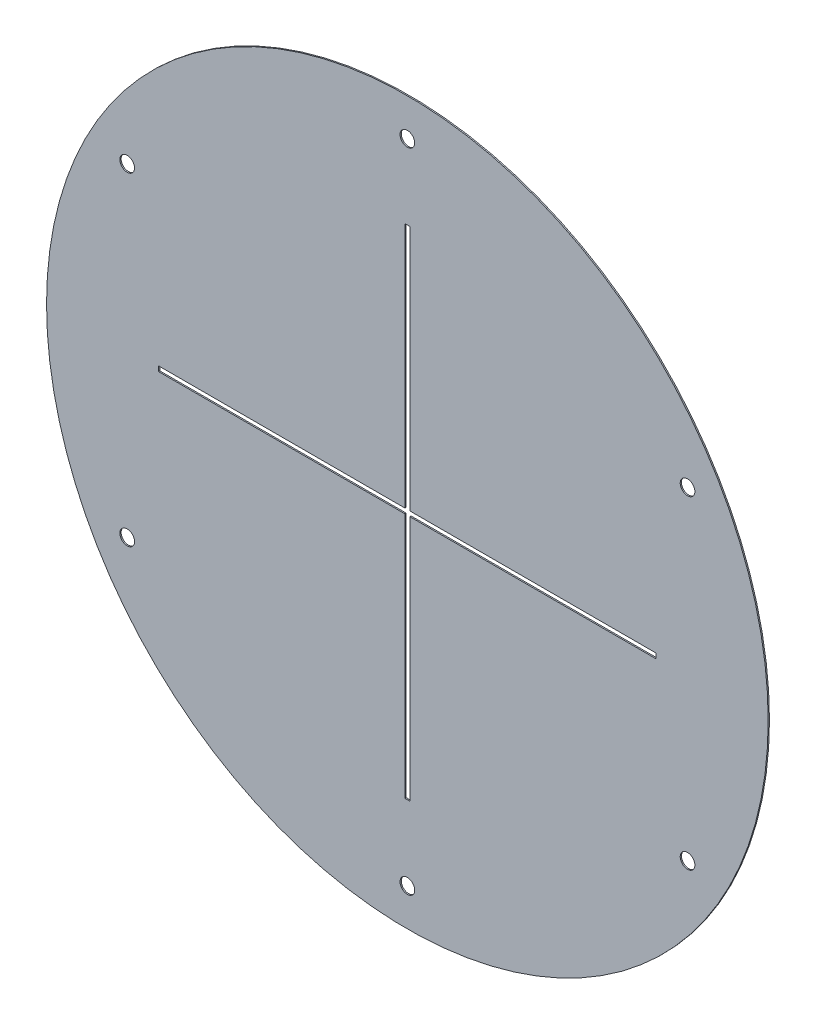
ISO-10303-21;
HEADER;
FILE_DESCRIPTION(('STEP AP214'),'2;1');
FILE_NAME('part.step','',(''),(''),'','','');
FILE_SCHEMA(('AUTOMOTIVE_DESIGN { 1 0 10303 214 1 1 1 1 }'));
ENDSEC;
DATA;
#1=APPLICATION_CONTEXT('core data for automotive mechanical design processes');
#2=APPLICATION_PROTOCOL_DEFINITION('international standard','automotive_design',2000,#1);
#3=PRODUCT_CONTEXT('',#1,'mechanical');
#4=PRODUCT('Part','Part','',(#3));
#5=PRODUCT_RELATED_PRODUCT_CATEGORY('part','',(#4));
#6=PRODUCT_DEFINITION_FORMATION('','',#4);
#7=PRODUCT_DEFINITION_CONTEXT('part definition',#1,'design');
#8=PRODUCT_DEFINITION('design','',#6,#7);
#9=PRODUCT_DEFINITION_SHAPE('','',#8);
#10=(LENGTH_UNIT() NAMED_UNIT(*) SI_UNIT(.MILLI.,.METRE.));
#11=(NAMED_UNIT(*) PLANE_ANGLE_UNIT() SI_UNIT($,.RADIAN.));
#12=(NAMED_UNIT(*) SI_UNIT($,.STERADIAN.) SOLID_ANGLE_UNIT());
#13=UNCERTAINTY_MEASURE_WITH_UNIT(LENGTH_MEASURE(1.E-05),#10,'distance_accuracy_value','');
#14=(GEOMETRIC_REPRESENTATION_CONTEXT(3) GLOBAL_UNCERTAINTY_ASSIGNED_CONTEXT((#13)) GLOBAL_UNIT_ASSIGNED_CONTEXT((#10,
#11,#12)) REPRESENTATION_CONTEXT('',''));
#15=CARTESIAN_POINT('',(0.,0.,0.));
#16=DIRECTION('',(0.,0.,1.));
#17=DIRECTION('',(1.,0.,0.));
#18=AXIS2_PLACEMENT_3D('',#15,#16,#17);
#19=CARTESIAN_POINT('',(0.,0.,0.254));
#20=DIRECTION('',(0.,0.,1.));
#21=DIRECTION('',(1.,0.,0.));
#22=AXIS2_PLACEMENT_3D('',#19,#20,#21);
#23=PLANE('',#22);
#24=CARTESIAN_POINT('',(0.,65.,0.254));
#25=DIRECTION('',(0.,0.,1.));
#26=DIRECTION('',(1.,0.,0.));
#27=AXIS2_PLACEMENT_3D('',#24,#25,#26);
#28=CIRCLE('',#27,1.4732);
#29=CARTESIAN_POINT('',(1.4732,65.,0.254));
#30=VERTEX_POINT('',#29);
#31=EDGE_CURVE('E510',#30,#30,#28,.T.);
#32=ORIENTED_EDGE('',*,*,#31,.F.);
#33=EDGE_LOOP('',(#32));
#34=FACE_BOUND('',#33,.T.);
#35=CARTESIAN_POINT('',(-56.2916512459885,-32.5,0.254));
#36=DIRECTION('',(0.,0.,1.));
#37=DIRECTION('',(1.,0.,0.));
#38=AXIS2_PLACEMENT_3D('',#35,#36,#37);
#39=CIRCLE('',#38,1.47319999999998);
#40=CARTESIAN_POINT('',(-54.8184512459885,-32.5,0.254));
#41=VERTEX_POINT('',#40);
#42=EDGE_CURVE('E522',#41,#41,#39,.T.);
#43=ORIENTED_EDGE('',*,*,#42,.F.);
#44=EDGE_LOOP('',(#43));
#45=FACE_BOUND('',#44,.T.);
#46=CARTESIAN_POINT('',(56.2916512459885,-32.5,0.254));
#47=DIRECTION('',(0.,0.,1.));
#48=DIRECTION('',(1.,0.,0.));
#49=AXIS2_PLACEMENT_3D('',#46,#47,#48);
#50=CIRCLE('',#49,1.4732);
#51=CARTESIAN_POINT('',(57.7648512459885,-32.5,0.254));
#52=VERTEX_POINT('',#51);
#53=EDGE_CURVE('E173',#52,#52,#50,.T.);
#54=ORIENTED_EDGE('',*,*,#53,.F.);
#55=EDGE_LOOP('',(#54));
#56=FACE_BOUND('',#55,.T.);
#57=CARTESIAN_POINT('',(0.,0.,0.254));
#58=DIRECTION('',(0.,0.,1.));
#59=DIRECTION('',(1.,0.,0.));
#60=AXIS2_PLACEMENT_3D('',#57,#58,#59);
#61=CIRCLE('',#60,72.5);
#62=CARTESIAN_POINT('',(72.5,0.,0.254));
#63=VERTEX_POINT('',#62);
#64=EDGE_CURVE('E11',#63,#63,#61,.T.);
#65=ORIENTED_EDGE('',*,*,#64,.T.);
#66=EDGE_LOOP('',(#65));
#67=FACE_BOUND('',#66,.T.);
#68=DIRECTION('',(0.,-1.,0.));
#69=VECTOR('',#68,1.);
#70=CARTESIAN_POINT('',(-0.500000000000014,50.,0.254));
#71=LINE('',#70,#69);
#72=CARTESIAN_POINT('',(-0.500000000000014,50.,0.254));
#73=VERTEX_POINT('',#72);
#74=CARTESIAN_POINT('',(-0.499999999999997,0.5,0.254));
#75=VERTEX_POINT('',#74);
#76=EDGE_CURVE('E136',#73,#75,#71,.T.);
#77=ORIENTED_EDGE('',*,*,#76,.F.);
#78=DIRECTION('',(-1.,0.,0.));
#79=VECTOR('',#78,1.);
#80=CARTESIAN_POINT('',(0.499999999999985,50.,0.254));
#81=LINE('',#80,#79);
#82=CARTESIAN_POINT('',(0.499999999999985,50.,0.254));
#83=VERTEX_POINT('',#82);
#84=EDGE_CURVE('E128',#83,#73,#81,.T.);
#85=ORIENTED_EDGE('',*,*,#84,.F.);
#86=DIRECTION('',(0.,1.,0.));
#87=VECTOR('',#86,1.);
#88=CARTESIAN_POINT('',(0.500000000000002,0.499999999999999,0.254));
#89=LINE('',#88,#87);
#90=CARTESIAN_POINT('',(0.500000000000002,0.499999999999999,0.254));
#91=VERTEX_POINT('',#90);
#92=EDGE_CURVE('E170',#91,#83,#89,.T.);
#93=ORIENTED_EDGE('',*,*,#92,.F.);
#94=DIRECTION('',(-1.,0.,0.));
#95=VECTOR('',#94,1.);
#96=CARTESIAN_POINT('',(50.,0.499999999999999,0.254));
#97=LINE('',#96,#95);
#98=CARTESIAN_POINT('',(50.,0.499999999999999,0.254));
#99=VERTEX_POINT('',#98);
#100=EDGE_CURVE('E168',#99,#91,#97,.T.);
#101=ORIENTED_EDGE('',*,*,#100,.F.);
#102=DIRECTION('',(0.,1.,0.));
#103=VECTOR('',#102,1.);
#104=CARTESIAN_POINT('',(50.,-0.5,0.254));
#105=LINE('',#104,#103);
#106=CARTESIAN_POINT('',(50.,-0.5,0.254));
#107=VERTEX_POINT('',#106);
#108=EDGE_CURVE('E166',#107,#99,#105,.T.);
#109=ORIENTED_EDGE('',*,*,#108,.F.);
#110=DIRECTION('',(1.,0.,0.));
#111=VECTOR('',#110,1.);
#112=CARTESIAN_POINT('',(0.500000000000002,-0.5,0.254));
#113=LINE('',#112,#111);
#114=CARTESIAN_POINT('',(0.500000000000002,-0.5,0.254));
#115=VERTEX_POINT('',#114);
#116=EDGE_CURVE('E164',#115,#107,#113,.T.);
#117=ORIENTED_EDGE('',*,*,#116,.F.);
#118=DIRECTION('',(0.,1.,0.));
#119=VECTOR('',#118,1.);
#120=CARTESIAN_POINT('',(0.500000000000002,-50.,0.254));
#121=LINE('',#120,#119);
#122=CARTESIAN_POINT('',(0.500000000000002,-50.,0.254));
#123=VERTEX_POINT('',#122);
#124=EDGE_CURVE('E162',#123,#115,#121,.T.);
#125=ORIENTED_EDGE('',*,*,#124,.F.);
#126=DIRECTION('',(1.,0.,0.));
#127=VECTOR('',#126,1.);
#128=CARTESIAN_POINT('',(-0.499999999999997,-50.,0.254));
#129=LINE('',#128,#127);
#130=CARTESIAN_POINT('',(-0.499999999999997,-50.,0.254));
#131=VERTEX_POINT('',#130);
#132=EDGE_CURVE('E160',#131,#123,#129,.T.);
#133=ORIENTED_EDGE('',*,*,#132,.F.);
#134=DIRECTION('',(0.,-1.,0.));
#135=VECTOR('',#134,1.);
#136=CARTESIAN_POINT('',(-0.499999999999997,-0.5,0.254));
#137=LINE('',#136,#135);
#138=CARTESIAN_POINT('',(-0.499999999999997,-0.5,0.254));
#139=VERTEX_POINT('',#138);
#140=EDGE_CURVE('E158',#139,#131,#137,.T.);
#141=ORIENTED_EDGE('',*,*,#140,.F.);
#142=DIRECTION('',(1.,0.,0.));
#143=VECTOR('',#142,1.);
#144=CARTESIAN_POINT('',(-50.,-0.5,0.254));
#145=LINE('',#144,#143);
#146=CARTESIAN_POINT('',(-50.,-0.5,0.254));
#147=VERTEX_POINT('',#146);
#148=EDGE_CURVE('E156',#147,#139,#145,.T.);
#149=ORIENTED_EDGE('',*,*,#148,.F.);
#150=DIRECTION('',(0.,-1.,0.));
#151=VECTOR('',#150,1.);
#152=CARTESIAN_POINT('',(-50.,0.5,0.254));
#153=LINE('',#152,#151);
#154=CARTESIAN_POINT('',(-50.,0.5,0.254));
#155=VERTEX_POINT('',#154);
#156=EDGE_CURVE('E151',#155,#147,#153,.T.);
#157=ORIENTED_EDGE('',*,*,#156,.F.);
#158=DIRECTION('',(-1.,0.,0.));
#159=VECTOR('',#158,1.);
#160=CARTESIAN_POINT('',(-0.499999999999997,0.5,0.254));
#161=LINE('',#160,#159);
#162=EDGE_CURVE('E149',#75,#155,#161,.T.);
#163=ORIENTED_EDGE('',*,*,#162,.F.);
#164=EDGE_LOOP('',(#77,#85,#93,#101,#109,#117,#125,#133,#141,#149,#157,#163));
#165=FACE_BOUND('',#164,.T.);
#166=CARTESIAN_POINT('',(0.,-65.,0.254));
#167=DIRECTION('',(0.,0.,1.));
#168=DIRECTION('',(1.,0.,0.));
#169=AXIS2_PLACEMENT_3D('',#166,#167,#168);
#170=CIRCLE('',#169,1.4732);
#171=CARTESIAN_POINT('',(1.47319999999998,-65.,0.254));
#172=VERTEX_POINT('',#171);
#173=EDGE_CURVE('E528',#172,#172,#170,.T.);
#174=ORIENTED_EDGE('',*,*,#173,.F.);
#175=EDGE_LOOP('',(#174));
#176=FACE_BOUND('',#175,.T.);
#177=CARTESIAN_POINT('',(-56.2916512459885,32.5,0.254));
#178=DIRECTION('',(0.,0.,1.));
#179=DIRECTION('',(1.,0.,0.));
#180=AXIS2_PLACEMENT_3D('',#177,#178,#179);
#181=CIRCLE('',#180,1.47319999999999);
#182=CARTESIAN_POINT('',(-54.8184512459885,32.5,0.254));
#183=VERTEX_POINT('',#182);
#184=EDGE_CURVE('E516',#183,#183,#181,.T.);
#185=ORIENTED_EDGE('',*,*,#184,.F.);
#186=EDGE_LOOP('',(#185));
#187=FACE_BOUND('',#186,.T.);
#188=CARTESIAN_POINT('',(56.2916512459885,32.5,0.254));
#189=DIRECTION('',(0.,0.,1.));
#190=DIRECTION('',(1.,0.,0.));
#191=AXIS2_PLACEMENT_3D('',#188,#189,#190);
#192=CIRCLE('',#191,1.47319999999999);
#193=CARTESIAN_POINT('',(57.7648512459885,32.5,0.254));
#194=VERTEX_POINT('',#193);
#195=EDGE_CURVE('E501',#194,#194,#192,.T.);
#196=ORIENTED_EDGE('',*,*,#195,.F.);
#197=EDGE_LOOP('',(#196));
#198=FACE_BOUND('',#197,.T.);
#199=ADVANCED_FACE('F39',(#34,#45,#56,#67,#165,#176,#187,#198),#23,.T.);
#200=CARTESIAN_POINT('',(0.,0.,0.));
#201=DIRECTION('',(0.,0.,1.));
#202=DIRECTION('',(1.,0.,0.));
#203=AXIS2_PLACEMENT_3D('',#200,#201,#202);
#204=PLANE('',#203);
#205=CARTESIAN_POINT('',(0.,0.,0.));
#206=DIRECTION('',(0.,0.,1.));
#207=DIRECTION('',(1.,0.,0.));
#208=AXIS2_PLACEMENT_3D('',#205,#206,#207);
#209=CIRCLE('',#208,72.5);
#210=CARTESIAN_POINT('',(72.5,0.,0.));
#211=VERTEX_POINT('',#210);
#212=EDGE_CURVE('E43',#211,#211,#209,.T.);
#213=ORIENTED_EDGE('',*,*,#212,.F.);
#214=EDGE_LOOP('',(#213));
#215=FACE_BOUND('',#214,.T.);
#216=DIRECTION('',(-1.,0.,0.));
#217=VECTOR('',#216,1.);
#218=CARTESIAN_POINT('',(0.499999999999985,50.,0.));
#219=LINE('',#218,#217);
#220=CARTESIAN_POINT('',(0.499999999999985,50.,0.));
#221=VERTEX_POINT('',#220);
#222=CARTESIAN_POINT('',(-0.500000000000014,50.,0.));
#223=VERTEX_POINT('',#222);
#224=EDGE_CURVE('E62',#221,#223,#219,.T.);
#225=ORIENTED_EDGE('',*,*,#224,.T.);
#226=DIRECTION('',(0.,-1.,0.));
#227=VECTOR('',#226,1.);
#228=CARTESIAN_POINT('',(-0.500000000000014,50.,0.));
#229=LINE('',#228,#227);
#230=CARTESIAN_POINT('',(-0.499999999999997,0.5,0.));
#231=VERTEX_POINT('',#230);
#232=EDGE_CURVE('E143',#223,#231,#229,.T.);
#233=ORIENTED_EDGE('',*,*,#232,.T.);
#234=DIRECTION('',(-1.,0.,0.));
#235=VECTOR('',#234,1.);
#236=CARTESIAN_POINT('',(-0.499999999999997,0.5,0.));
#237=LINE('',#236,#235);
#238=CARTESIAN_POINT('',(-50.,0.5,0.));
#239=VERTEX_POINT('',#238);
#240=EDGE_CURVE('E175',#231,#239,#237,.T.);
#241=ORIENTED_EDGE('',*,*,#240,.T.);
#242=DIRECTION('',(0.,-1.,0.));
#243=VECTOR('',#242,1.);
#244=CARTESIAN_POINT('',(-50.,0.5,0.));
#245=LINE('',#244,#243);
#246=CARTESIAN_POINT('',(-50.,-0.5,0.));
#247=VERTEX_POINT('',#246);
#248=EDGE_CURVE('E178',#239,#247,#245,.T.);
#249=ORIENTED_EDGE('',*,*,#248,.T.);
#250=DIRECTION('',(1.,0.,0.));
#251=VECTOR('',#250,1.);
#252=CARTESIAN_POINT('',(-50.,-0.5,0.));
#253=LINE('',#252,#251);
#254=CARTESIAN_POINT('',(-0.499999999999997,-0.5,0.));
#255=VERTEX_POINT('',#254);
#256=EDGE_CURVE('E181',#247,#255,#253,.T.);
#257=ORIENTED_EDGE('',*,*,#256,.T.);
#258=DIRECTION('',(0.,-1.,0.));
#259=VECTOR('',#258,1.);
#260=CARTESIAN_POINT('',(-0.499999999999997,-0.5,0.));
#261=LINE('',#260,#259);
#262=CARTESIAN_POINT('',(-0.499999999999997,-50.,0.));
#263=VERTEX_POINT('',#262);
#264=EDGE_CURVE('E184',#255,#263,#261,.T.);
#265=ORIENTED_EDGE('',*,*,#264,.T.);
#266=DIRECTION('',(1.,0.,0.));
#267=VECTOR('',#266,1.);
#268=CARTESIAN_POINT('',(-0.499999999999997,-50.,0.));
#269=LINE('',#268,#267);
#270=CARTESIAN_POINT('',(0.500000000000002,-50.,0.));
#271=VERTEX_POINT('',#270);
#272=EDGE_CURVE('E187',#263,#271,#269,.T.);
#273=ORIENTED_EDGE('',*,*,#272,.T.);
#274=DIRECTION('',(0.,1.,0.));
#275=VECTOR('',#274,1.);
#276=CARTESIAN_POINT('',(0.500000000000002,-50.,0.));
#277=LINE('',#276,#275);
#278=CARTESIAN_POINT('',(0.500000000000002,-0.5,0.));
#279=VERTEX_POINT('',#278);
#280=EDGE_CURVE('E190',#271,#279,#277,.T.);
#281=ORIENTED_EDGE('',*,*,#280,.T.);
#282=DIRECTION('',(1.,0.,0.));
#283=VECTOR('',#282,1.);
#284=CARTESIAN_POINT('',(0.500000000000002,-0.5,0.));
#285=LINE('',#284,#283);
#286=CARTESIAN_POINT('',(50.,-0.5,0.));
#287=VERTEX_POINT('',#286);
#288=EDGE_CURVE('E193',#279,#287,#285,.T.);
#289=ORIENTED_EDGE('',*,*,#288,.T.);
#290=DIRECTION('',(0.,1.,0.));
#291=VECTOR('',#290,1.);
#292=CARTESIAN_POINT('',(50.,-0.5,0.));
#293=LINE('',#292,#291);
#294=CARTESIAN_POINT('',(50.,0.499999999999999,0.));
#295=VERTEX_POINT('',#294);
#296=EDGE_CURVE('E196',#287,#295,#293,.T.);
#297=ORIENTED_EDGE('',*,*,#296,.T.);
#298=DIRECTION('',(-1.,0.,0.));
#299=VECTOR('',#298,1.);
#300=CARTESIAN_POINT('',(50.,0.499999999999999,0.));
#301=LINE('',#300,#299);
#302=CARTESIAN_POINT('',(0.500000000000002,0.499999999999999,0.));
#303=VERTEX_POINT('',#302);
#304=EDGE_CURVE('E199',#295,#303,#301,.T.);
#305=ORIENTED_EDGE('',*,*,#304,.T.);
#306=DIRECTION('',(0.,1.,0.));
#307=VECTOR('',#306,1.);
#308=CARTESIAN_POINT('',(0.500000000000002,0.499999999999999,0.));
#309=LINE('',#308,#307);
#310=EDGE_CURVE('E137',#303,#221,#309,.T.);
#311=ORIENTED_EDGE('',*,*,#310,.T.);
#312=EDGE_LOOP('',(#225,#233,#241,#249,#257,#265,#273,#281,#289,#297,#305,#311));
#313=FACE_BOUND('',#312,.T.);
#314=CARTESIAN_POINT('',(56.2916512459885,-32.5,0.));
#315=DIRECTION('',(0.,0.,1.));
#316=DIRECTION('',(1.,0.,0.));
#317=AXIS2_PLACEMENT_3D('',#314,#315,#316);
#318=CIRCLE('',#317,1.4732);
#319=CARTESIAN_POINT('',(57.7648512459885,-32.5,0.));
#320=VERTEX_POINT('',#319);
#321=EDGE_CURVE('E531',#320,#320,#318,.T.);
#322=ORIENTED_EDGE('',*,*,#321,.T.);
#323=EDGE_LOOP('',(#322));
#324=FACE_BOUND('',#323,.T.);
#325=CARTESIAN_POINT('',(0.,-65.,0.));
#326=DIRECTION('',(0.,0.,1.));
#327=DIRECTION('',(1.,0.,0.));
#328=AXIS2_PLACEMENT_3D('',#325,#326,#327);
#329=CIRCLE('',#328,1.4732);
#330=CARTESIAN_POINT('',(1.47319999999998,-65.,0.));
#331=VERTEX_POINT('',#330);
#332=EDGE_CURVE('E525',#331,#331,#329,.T.);
#333=ORIENTED_EDGE('',*,*,#332,.T.);
#334=EDGE_LOOP('',(#333));
#335=FACE_BOUND('',#334,.T.);
#336=CARTESIAN_POINT('',(-56.2916512459885,-32.5,0.));
#337=DIRECTION('',(0.,0.,1.));
#338=DIRECTION('',(1.,0.,0.));
#339=AXIS2_PLACEMENT_3D('',#336,#337,#338);
#340=CIRCLE('',#339,1.47319999999998);
#341=CARTESIAN_POINT('',(-54.8184512459885,-32.5,0.));
#342=VERTEX_POINT('',#341);
#343=EDGE_CURVE('E519',#342,#342,#340,.T.);
#344=ORIENTED_EDGE('',*,*,#343,.T.);
#345=EDGE_LOOP('',(#344));
#346=FACE_BOUND('',#345,.T.);
#347=CARTESIAN_POINT('',(-56.2916512459885,32.5,0.));
#348=DIRECTION('',(0.,0.,1.));
#349=DIRECTION('',(1.,0.,0.));
#350=AXIS2_PLACEMENT_3D('',#347,#348,#349);
#351=CIRCLE('',#350,1.47319999999999);
#352=CARTESIAN_POINT('',(-54.8184512459885,32.5,0.));
#353=VERTEX_POINT('',#352);
#354=EDGE_CURVE('E513',#353,#353,#351,.T.);
#355=ORIENTED_EDGE('',*,*,#354,.T.);
#356=EDGE_LOOP('',(#355));
#357=FACE_BOUND('',#356,.T.);
#358=CARTESIAN_POINT('',(0.,65.,0.));
#359=DIRECTION('',(0.,0.,1.));
#360=DIRECTION('',(1.,0.,0.));
#361=AXIS2_PLACEMENT_3D('',#358,#359,#360);
#362=CIRCLE('',#361,1.4732);
#363=CARTESIAN_POINT('',(1.4732,65.,0.));
#364=VERTEX_POINT('',#363);
#365=EDGE_CURVE('E507',#364,#364,#362,.T.);
#366=ORIENTED_EDGE('',*,*,#365,.T.);
#367=EDGE_LOOP('',(#366));
#368=FACE_BOUND('',#367,.T.);
#369=CARTESIAN_POINT('',(56.2916512459885,32.5,0.));
#370=DIRECTION('',(0.,0.,1.));
#371=DIRECTION('',(1.,0.,0.));
#372=AXIS2_PLACEMENT_3D('',#369,#370,#371);
#373=CIRCLE('',#372,1.47319999999999);
#374=CARTESIAN_POINT('',(57.7648512459885,32.5,0.));
#375=VERTEX_POINT('',#374);
#376=EDGE_CURVE('E504',#375,#375,#373,.T.);
#377=ORIENTED_EDGE('',*,*,#376,.T.);
#378=EDGE_LOOP('',(#377));
#379=FACE_BOUND('',#378,.T.);
#380=ADVANCED_FACE('F228',(#215,#313,#324,#335,#346,#357,#368,#379),#204,.F.);
#381=CARTESIAN_POINT('',(0.,0.,0.254));
#382=DIRECTION('',(0.,0.,-1.));
#383=DIRECTION('',(-1.,0.,0.));
#384=AXIS2_PLACEMENT_3D('',#381,#382,#383);
#385=CYLINDRICAL_SURFACE('',#384,72.5);
#386=ORIENTED_EDGE('',*,*,#64,.F.);
#387=EDGE_LOOP('',(#386));
#388=FACE_BOUND('',#387,.T.);
#389=ORIENTED_EDGE('',*,*,#212,.T.);
#390=EDGE_LOOP('',(#389));
#391=FACE_BOUND('',#390,.T.);
#392=ADVANCED_FACE('F41',(#388,#391),#385,.T.);
#393=CARTESIAN_POINT('',(0.499999999999985,50.,0.254));
#394=DIRECTION('',(0.,-1.,0.));
#395=DIRECTION('',(0.,0.,-1.));
#396=AXIS2_PLACEMENT_3D('',#393,#394,#395);
#397=PLANE('',#396);
#398=ORIENTED_EDGE('',*,*,#224,.F.);
#399=DIRECTION('',(0.,0.,-1.));
#400=VECTOR('',#399,1.);
#401=CARTESIAN_POINT('',(0.499999999999985,50.,0.254));
#402=LINE('',#401,#400);
#403=EDGE_CURVE('E132',#83,#221,#402,.T.);
#404=ORIENTED_EDGE('',*,*,#403,.F.);
#405=ORIENTED_EDGE('',*,*,#84,.T.);
#406=DIRECTION('',(0.,0.,-1.));
#407=VECTOR('',#406,1.);
#408=CARTESIAN_POINT('',(-0.500000000000014,50.,0.254));
#409=LINE('',#408,#407);
#410=EDGE_CURVE('E131',#73,#223,#409,.T.);
#411=ORIENTED_EDGE('',*,*,#410,.T.);
#412=EDGE_LOOP('',(#398,#404,#405,#411));
#413=FACE_BOUND('',#412,.T.);
#414=ADVANCED_FACE('F130',(#413),#397,.T.);
#415=CARTESIAN_POINT('',(-0.500000000000014,50.,0.254));
#416=DIRECTION('',(1.,0.,0.));
#417=DIRECTION('',(0.,1.,0.));
#418=AXIS2_PLACEMENT_3D('',#415,#416,#417);
#419=PLANE('',#418);
#420=ORIENTED_EDGE('',*,*,#232,.F.);
#421=ORIENTED_EDGE('',*,*,#410,.F.);
#422=ORIENTED_EDGE('',*,*,#76,.T.);
#423=DIRECTION('',(0.,0.,-1.));
#424=VECTOR('',#423,1.);
#425=CARTESIAN_POINT('',(-0.499999999999997,0.5,0.254));
#426=LINE('',#425,#424);
#427=EDGE_CURVE('E144',#75,#231,#426,.T.);
#428=ORIENTED_EDGE('',*,*,#427,.T.);
#429=EDGE_LOOP('',(#420,#421,#422,#428));
#430=FACE_BOUND('',#429,.T.);
#431=ADVANCED_FACE('F140',(#430),#419,.T.);
#432=CARTESIAN_POINT('',(-0.499999999999997,0.5,0.254));
#433=DIRECTION('',(0.,-1.,0.));
#434=DIRECTION('',(0.,0.,-1.));
#435=AXIS2_PLACEMENT_3D('',#432,#433,#434);
#436=PLANE('',#435);
#437=ORIENTED_EDGE('',*,*,#240,.F.);
#438=ORIENTED_EDGE('',*,*,#427,.F.);
#439=ORIENTED_EDGE('',*,*,#162,.T.);
#440=DIRECTION('',(0.,0.,-1.));
#441=VECTOR('',#440,1.);
#442=CARTESIAN_POINT('',(-50.,0.5,0.254));
#443=LINE('',#442,#441);
#444=EDGE_CURVE('E220',#155,#239,#443,.T.);
#445=ORIENTED_EDGE('',*,*,#444,.T.);
#446=EDGE_LOOP('',(#437,#438,#439,#445));
#447=FACE_BOUND('',#446,.T.);
#448=ADVANCED_FACE('F224',(#447),#436,.T.);
#449=CARTESIAN_POINT('',(-50.,0.5,0.254));
#450=DIRECTION('',(1.,0.,0.));
#451=DIRECTION('',(0.,0.,-1.));
#452=AXIS2_PLACEMENT_3D('',#449,#450,#451);
#453=PLANE('',#452);
#454=ORIENTED_EDGE('',*,*,#248,.F.);
#455=ORIENTED_EDGE('',*,*,#444,.F.);
#456=ORIENTED_EDGE('',*,*,#156,.T.);
#457=DIRECTION('',(0.,0.,-1.));
#458=VECTOR('',#457,1.);
#459=CARTESIAN_POINT('',(-50.,-0.5,0.254));
#460=LINE('',#459,#458);
#461=EDGE_CURVE('E218',#147,#247,#460,.T.);
#462=ORIENTED_EDGE('',*,*,#461,.T.);
#463=EDGE_LOOP('',(#454,#455,#456,#462));
#464=FACE_BOUND('',#463,.T.);
#465=ADVANCED_FACE('F267',(#464),#453,.T.);
#466=CARTESIAN_POINT('',(-50.,-0.5,0.254));
#467=DIRECTION('',(0.,1.,0.));
#468=DIRECTION('',(0.,0.,1.));
#469=AXIS2_PLACEMENT_3D('',#466,#467,#468);
#470=PLANE('',#469);
#471=ORIENTED_EDGE('',*,*,#256,.F.);
#472=ORIENTED_EDGE('',*,*,#461,.F.);
#473=ORIENTED_EDGE('',*,*,#148,.T.);
#474=DIRECTION('',(0.,0.,-1.));
#475=VECTOR('',#474,1.);
#476=CARTESIAN_POINT('',(-0.499999999999997,-0.5,0.254));
#477=LINE('',#476,#475);
#478=EDGE_CURVE('E216',#139,#255,#477,.T.);
#479=ORIENTED_EDGE('',*,*,#478,.T.);
#480=EDGE_LOOP('',(#471,#472,#473,#479));
#481=FACE_BOUND('',#480,.T.);
#482=ADVANCED_FACE('F265',(#481),#470,.T.);
#483=CARTESIAN_POINT('',(-0.499999999999997,-0.5,0.254));
#484=DIRECTION('',(1.,0.,0.));
#485=DIRECTION('',(0.,0.,-1.));
#486=AXIS2_PLACEMENT_3D('',#483,#484,#485);
#487=PLANE('',#486);
#488=ORIENTED_EDGE('',*,*,#264,.F.);
#489=ORIENTED_EDGE('',*,*,#478,.F.);
#490=ORIENTED_EDGE('',*,*,#140,.T.);
#491=DIRECTION('',(0.,0.,-1.));
#492=VECTOR('',#491,1.);
#493=CARTESIAN_POINT('',(-0.499999999999997,-50.,0.254));
#494=LINE('',#493,#492);
#495=EDGE_CURVE('E214',#131,#263,#494,.T.);
#496=ORIENTED_EDGE('',*,*,#495,.T.);
#497=EDGE_LOOP('',(#488,#489,#490,#496));
#498=FACE_BOUND('',#497,.T.);
#499=ADVANCED_FACE('F259',(#498),#487,.T.);
#500=CARTESIAN_POINT('',(-0.499999999999997,-50.,0.254));
#501=DIRECTION('',(0.,1.,0.));
#502=DIRECTION('',(0.,0.,1.));
#503=AXIS2_PLACEMENT_3D('',#500,#501,#502);
#504=PLANE('',#503);
#505=ORIENTED_EDGE('',*,*,#272,.F.);
#506=ORIENTED_EDGE('',*,*,#495,.F.);
#507=ORIENTED_EDGE('',*,*,#132,.T.);
#508=DIRECTION('',(0.,0.,-1.));
#509=VECTOR('',#508,1.);
#510=CARTESIAN_POINT('',(0.500000000000002,-50.,0.254));
#511=LINE('',#510,#509);
#512=EDGE_CURVE('E212',#123,#271,#511,.T.);
#513=ORIENTED_EDGE('',*,*,#512,.T.);
#514=EDGE_LOOP('',(#505,#506,#507,#513));
#515=FACE_BOUND('',#514,.T.);
#516=ADVANCED_FACE('F255',(#515),#504,.T.);
#517=CARTESIAN_POINT('',(0.500000000000002,-50.,0.254));
#518=DIRECTION('',(-1.,0.,0.));
#519=DIRECTION('',(0.,0.,1.));
#520=AXIS2_PLACEMENT_3D('',#517,#518,#519);
#521=PLANE('',#520);
#522=ORIENTED_EDGE('',*,*,#280,.F.);
#523=ORIENTED_EDGE('',*,*,#512,.F.);
#524=ORIENTED_EDGE('',*,*,#124,.T.);
#525=DIRECTION('',(0.,0.,-1.));
#526=VECTOR('',#525,1.);
#527=CARTESIAN_POINT('',(0.500000000000002,-0.5,0.254));
#528=LINE('',#527,#526);
#529=EDGE_CURVE('E210',#115,#279,#528,.T.);
#530=ORIENTED_EDGE('',*,*,#529,.T.);
#531=EDGE_LOOP('',(#522,#523,#524,#530));
#532=FACE_BOUND('',#531,.T.);
#533=ADVANCED_FACE('F252',(#532),#521,.T.);
#534=CARTESIAN_POINT('',(0.500000000000002,-0.5,0.254));
#535=DIRECTION('',(0.,1.,0.));
#536=DIRECTION('',(0.,0.,1.));
#537=AXIS2_PLACEMENT_3D('',#534,#535,#536);
#538=PLANE('',#537);
#539=ORIENTED_EDGE('',*,*,#288,.F.);
#540=ORIENTED_EDGE('',*,*,#529,.F.);
#541=ORIENTED_EDGE('',*,*,#116,.T.);
#542=DIRECTION('',(0.,0.,-1.));
#543=VECTOR('',#542,1.);
#544=CARTESIAN_POINT('',(50.,-0.5,0.254));
#545=LINE('',#544,#543);
#546=EDGE_CURVE('E208',#107,#287,#545,.T.);
#547=ORIENTED_EDGE('',*,*,#546,.T.);
#548=EDGE_LOOP('',(#539,#540,#541,#547));
#549=FACE_BOUND('',#548,.T.);
#550=ADVANCED_FACE('F244',(#549),#538,.T.);
#551=CARTESIAN_POINT('',(50.,-0.5,0.254));
#552=DIRECTION('',(-1.,0.,0.));
#553=DIRECTION('',(0.,0.,1.));
#554=AXIS2_PLACEMENT_3D('',#551,#552,#553);
#555=PLANE('',#554);
#556=ORIENTED_EDGE('',*,*,#296,.F.);
#557=ORIENTED_EDGE('',*,*,#546,.F.);
#558=ORIENTED_EDGE('',*,*,#108,.T.);
#559=DIRECTION('',(0.,0.,-1.));
#560=VECTOR('',#559,1.);
#561=CARTESIAN_POINT('',(50.,0.499999999999999,0.254));
#562=LINE('',#561,#560);
#563=EDGE_CURVE('E206',#99,#295,#562,.T.);
#564=ORIENTED_EDGE('',*,*,#563,.T.);
#565=EDGE_LOOP('',(#556,#557,#558,#564));
#566=FACE_BOUND('',#565,.T.);
#567=ADVANCED_FACE('F240',(#566),#555,.T.);
#568=CARTESIAN_POINT('',(50.,0.499999999999999,0.254));
#569=DIRECTION('',(0.,-1.,0.));
#570=DIRECTION('',(0.,0.,-1.));
#571=AXIS2_PLACEMENT_3D('',#568,#569,#570);
#572=PLANE('',#571);
#573=ORIENTED_EDGE('',*,*,#304,.F.);
#574=ORIENTED_EDGE('',*,*,#563,.F.);
#575=ORIENTED_EDGE('',*,*,#100,.T.);
#576=DIRECTION('',(0.,0.,-1.));
#577=VECTOR('',#576,1.);
#578=CARTESIAN_POINT('',(0.500000000000002,0.499999999999999,0.254));
#579=LINE('',#578,#577);
#580=EDGE_CURVE('E54',#91,#303,#579,.T.);
#581=ORIENTED_EDGE('',*,*,#580,.T.);
#582=EDGE_LOOP('',(#573,#574,#575,#581));
#583=FACE_BOUND('',#582,.T.);
#584=ADVANCED_FACE('F237',(#583),#572,.T.);
#585=CARTESIAN_POINT('',(0.500000000000002,0.499999999999999,0.254));
#586=DIRECTION('',(-1.,0.,0.));
#587=DIRECTION('',(0.,-1.,0.));
#588=AXIS2_PLACEMENT_3D('',#585,#586,#587);
#589=PLANE('',#588);
#590=ORIENTED_EDGE('',*,*,#310,.F.);
#591=ORIENTED_EDGE('',*,*,#580,.F.);
#592=ORIENTED_EDGE('',*,*,#92,.T.);
#593=ORIENTED_EDGE('',*,*,#403,.T.);
#594=EDGE_LOOP('',(#590,#591,#592,#593));
#595=FACE_BOUND('',#594,.T.);
#596=ADVANCED_FACE('F231',(#595),#589,.T.);
#597=CARTESIAN_POINT('',(56.2916512459885,-32.5,0.254));
#598=DIRECTION('',(0.,0.,-1.));
#599=DIRECTION('',(-1.,0.,0.));
#600=AXIS2_PLACEMENT_3D('',#597,#598,#599);
#601=CYLINDRICAL_SURFACE('',#600,1.4732);
#602=ORIENTED_EDGE('',*,*,#53,.T.);
#603=EDGE_LOOP('',(#602));
#604=FACE_BOUND('',#603,.T.);
#605=ORIENTED_EDGE('',*,*,#321,.F.);
#606=EDGE_LOOP('',(#605));
#607=FACE_BOUND('',#606,.T.);
#608=ADVANCED_FACE('F374',(#604,#607),#601,.F.);
#609=CARTESIAN_POINT('',(0.,-65.,0.254));
#610=DIRECTION('',(0.,0.,-1.));
#611=DIRECTION('',(-1.,0.,0.));
#612=AXIS2_PLACEMENT_3D('',#609,#610,#611);
#613=CYLINDRICAL_SURFACE('',#612,1.4732);
#614=ORIENTED_EDGE('',*,*,#173,.T.);
#615=EDGE_LOOP('',(#614));
#616=FACE_BOUND('',#615,.T.);
#617=ORIENTED_EDGE('',*,*,#332,.F.);
#618=EDGE_LOOP('',(#617));
#619=FACE_BOUND('',#618,.T.);
#620=ADVANCED_FACE('F384',(#616,#619),#613,.F.);
#621=CARTESIAN_POINT('',(-56.2916512459885,-32.5,0.254));
#622=DIRECTION('',(0.,0.,-1.));
#623=DIRECTION('',(-1.,0.,0.));
#624=AXIS2_PLACEMENT_3D('',#621,#622,#623);
#625=CYLINDRICAL_SURFACE('',#624,1.47319999999998);
#626=ORIENTED_EDGE('',*,*,#42,.T.);
#627=EDGE_LOOP('',(#626));
#628=FACE_BOUND('',#627,.T.);
#629=ORIENTED_EDGE('',*,*,#343,.F.);
#630=EDGE_LOOP('',(#629));
#631=FACE_BOUND('',#630,.T.);
#632=ADVANCED_FACE('F395',(#628,#631),#625,.F.);
#633=CARTESIAN_POINT('',(-56.2916512459885,32.5,0.254));
#634=DIRECTION('',(0.,0.,-1.));
#635=DIRECTION('',(-1.,0.,0.));
#636=AXIS2_PLACEMENT_3D('',#633,#634,#635);
#637=CYLINDRICAL_SURFACE('',#636,1.47319999999999);
#638=ORIENTED_EDGE('',*,*,#184,.T.);
#639=EDGE_LOOP('',(#638));
#640=FACE_BOUND('',#639,.T.);
#641=ORIENTED_EDGE('',*,*,#354,.F.);
#642=EDGE_LOOP('',(#641));
#643=FACE_BOUND('',#642,.T.);
#644=ADVANCED_FACE('F406',(#640,#643),#637,.F.);
#645=CARTESIAN_POINT('',(0.,65.,0.254));
#646=DIRECTION('',(0.,0.,-1.));
#647=DIRECTION('',(-1.,0.,0.));
#648=AXIS2_PLACEMENT_3D('',#645,#646,#647);
#649=CYLINDRICAL_SURFACE('',#648,1.4732);
#650=ORIENTED_EDGE('',*,*,#31,.T.);
#651=EDGE_LOOP('',(#650));
#652=FACE_BOUND('',#651,.T.);
#653=ORIENTED_EDGE('',*,*,#365,.F.);
#654=EDGE_LOOP('',(#653));
#655=FACE_BOUND('',#654,.T.);
#656=ADVANCED_FACE('F417',(#652,#655),#649,.F.);
#657=CARTESIAN_POINT('',(56.2916512459885,32.5,0.254));
#658=DIRECTION('',(0.,0.,-1.));
#659=DIRECTION('',(-1.,0.,0.));
#660=AXIS2_PLACEMENT_3D('',#657,#658,#659);
#661=CYLINDRICAL_SURFACE('',#660,1.47319999999999);
#662=ORIENTED_EDGE('',*,*,#195,.T.);
#663=EDGE_LOOP('',(#662));
#664=FACE_BOUND('',#663,.T.);
#665=ORIENTED_EDGE('',*,*,#376,.F.);
#666=EDGE_LOOP('',(#665));
#667=FACE_BOUND('',#666,.T.);
#668=ADVANCED_FACE('F428',(#664,#667),#661,.F.);
#669=CLOSED_SHELL('',(#199,#380,#392,#414,#431,#448,#465,#482,#499,#516,#533,#550,#567,#584,
#596,#608,#620,#632,#644,#656,#668));
#670=MANIFOLD_SOLID_BREP('B2',#669);
#671=ADVANCED_BREP_SHAPE_REPRESENTATION('',(#18,#670),#14);
#672=SHAPE_DEFINITION_REPRESENTATION(#9,#671);
ENDSEC;
END-ISO-10303-21;
